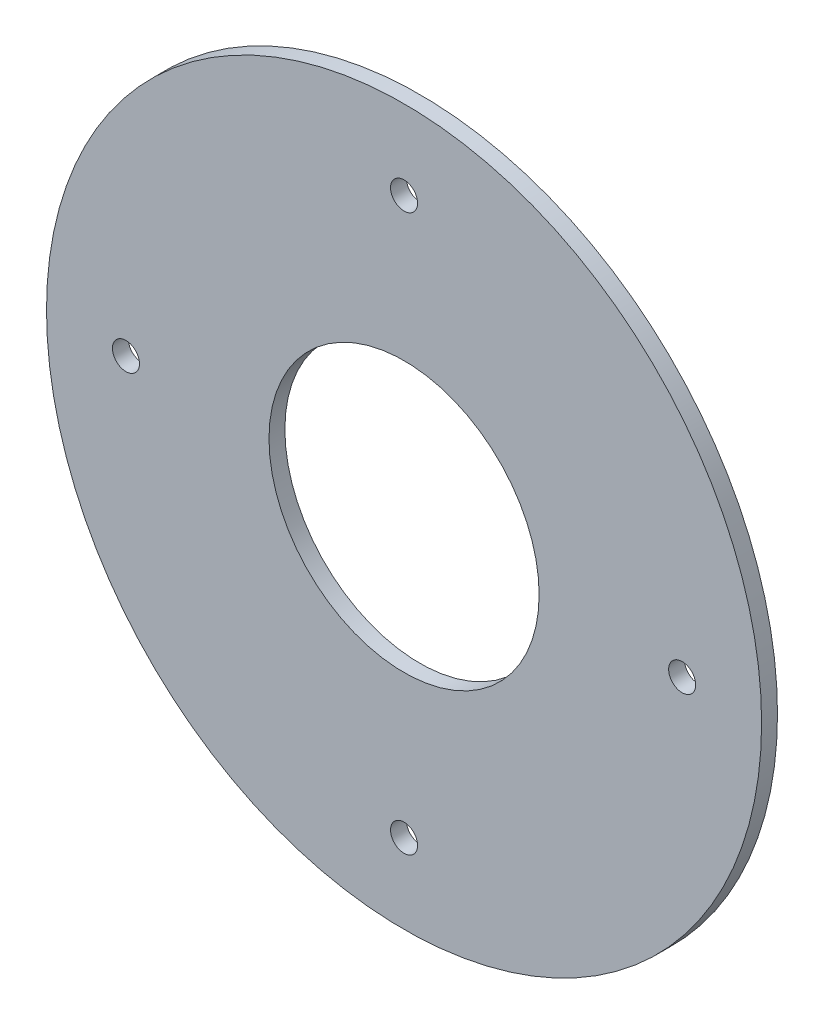
ISO-10303-21;
HEADER;
FILE_DESCRIPTION(('STEP AP214'),'2;1');
FILE_NAME('part.step','',(''),(''),'','','');
FILE_SCHEMA(('AUTOMOTIVE_DESIGN { 1 0 10303 214 1 1 1 1 }'));
ENDSEC;
DATA;
#1=APPLICATION_CONTEXT('core data for automotive mechanical design processes');
#2=APPLICATION_PROTOCOL_DEFINITION('international standard','automotive_design',2000,#1);
#3=PRODUCT_CONTEXT('',#1,'mechanical');
#4=PRODUCT('Part','Part','',(#3));
#5=PRODUCT_RELATED_PRODUCT_CATEGORY('part','',(#4));
#6=PRODUCT_DEFINITION_FORMATION('','',#4);
#7=PRODUCT_DEFINITION_CONTEXT('part definition',#1,'design');
#8=PRODUCT_DEFINITION('design','',#6,#7);
#9=PRODUCT_DEFINITION_SHAPE('','',#8);
#10=(LENGTH_UNIT() NAMED_UNIT(*) SI_UNIT(.MILLI.,.METRE.));
#11=(NAMED_UNIT(*) PLANE_ANGLE_UNIT() SI_UNIT($,.RADIAN.));
#12=(NAMED_UNIT(*) SI_UNIT($,.STERADIAN.) SOLID_ANGLE_UNIT());
#13=UNCERTAINTY_MEASURE_WITH_UNIT(LENGTH_MEASURE(1.E-05),#10,'distance_accuracy_value','');
#14=(GEOMETRIC_REPRESENTATION_CONTEXT(3) GLOBAL_UNCERTAINTY_ASSIGNED_CONTEXT((#13)) GLOBAL_UNIT_ASSIGNED_CONTEXT((#10,
#11,#12)) REPRESENTATION_CONTEXT('',''));
#15=CARTESIAN_POINT('',(0.,0.,0.));
#16=DIRECTION('',(0.,0.,1.));
#17=DIRECTION('',(1.,0.,0.));
#18=AXIS2_PLACEMENT_3D('',#15,#16,#17);
#19=CARTESIAN_POINT('',(0.,0.,2.));
#20=DIRECTION('',(0.,0.,1.));
#21=DIRECTION('',(1.,0.,0.));
#22=AXIS2_PLACEMENT_3D('',#19,#20,#21);
#23=PLANE('',#22);
#24=CARTESIAN_POINT('',(0.,35.,2.));
#25=DIRECTION('',(0.,0.,1.));
#26=DIRECTION('',(1.,0.,0.));
#27=AXIS2_PLACEMENT_3D('',#24,#25,#26);
#28=CIRCLE('',#27,1.7);
#29=CARTESIAN_POINT('',(1.7,35.,2.));
#30=VERTEX_POINT('',#29);
#31=EDGE_CURVE('E72',#30,#30,#28,.T.);
#32=ORIENTED_EDGE('',*,*,#31,.F.);
#33=EDGE_LOOP('',(#32));
#34=FACE_BOUND('',#33,.T.);
#35=CARTESIAN_POINT('',(-35.,0.,2.));
#36=DIRECTION('',(0.,0.,1.));
#37=DIRECTION('',(1.,0.,0.));
#38=AXIS2_PLACEMENT_3D('',#35,#36,#37);
#39=CIRCLE('',#38,1.7);
#40=CARTESIAN_POINT('',(-33.3,0.,2.));
#41=VERTEX_POINT('',#40);
#42=EDGE_CURVE('E66',#41,#41,#39,.T.);
#43=ORIENTED_EDGE('',*,*,#42,.F.);
#44=EDGE_LOOP('',(#43));
#45=FACE_BOUND('',#44,.T.);
#46=CARTESIAN_POINT('',(0.,-35.,2.));
#47=DIRECTION('',(0.,0.,1.));
#48=DIRECTION('',(1.,0.,0.));
#49=AXIS2_PLACEMENT_3D('',#46,#47,#48);
#50=CIRCLE('',#49,1.7);
#51=CARTESIAN_POINT('',(1.7,-35.,2.));
#52=VERTEX_POINT('',#51);
#53=EDGE_CURVE('E60',#52,#52,#50,.T.);
#54=ORIENTED_EDGE('',*,*,#53,.F.);
#55=EDGE_LOOP('',(#54));
#56=FACE_BOUND('',#55,.T.);
#57=CARTESIAN_POINT('',(35.,0.,2.));
#58=DIRECTION('',(0.,0.,1.));
#59=DIRECTION('',(1.,0.,0.));
#60=AXIS2_PLACEMENT_3D('',#57,#58,#59);
#61=CIRCLE('',#60,1.7);
#62=CARTESIAN_POINT('',(36.7,0.,2.));
#63=VERTEX_POINT('',#62);
#64=EDGE_CURVE('E54',#63,#63,#61,.T.);
#65=ORIENTED_EDGE('',*,*,#64,.F.);
#66=EDGE_LOOP('',(#65));
#67=FACE_BOUND('',#66,.T.);
#68=CARTESIAN_POINT('',(0.,0.,2.));
#69=DIRECTION('',(0.,0.,1.));
#70=DIRECTION('',(1.,0.,0.));
#71=AXIS2_PLACEMENT_3D('',#68,#69,#70);
#72=CIRCLE('',#71,45.);
#73=CARTESIAN_POINT('',(45.,0.,2.));
#74=VERTEX_POINT('',#73);
#75=EDGE_CURVE('E10',#74,#74,#72,.T.);
#76=ORIENTED_EDGE('',*,*,#75,.T.);
#77=EDGE_LOOP('',(#76));
#78=FACE_BOUND('',#77,.T.);
#79=CARTESIAN_POINT('',(0.,0.,2.));
#80=DIRECTION('',(0.,0.,1.));
#81=DIRECTION('',(1.,0.,0.));
#82=AXIS2_PLACEMENT_3D('',#79,#80,#81);
#83=CIRCLE('',#82,17.);
#84=CARTESIAN_POINT('',(17.,0.,2.));
#85=VERTEX_POINT('',#84);
#86=EDGE_CURVE('E44',#85,#85,#83,.T.);
#87=ORIENTED_EDGE('',*,*,#86,.F.);
#88=EDGE_LOOP('',(#87));
#89=FACE_BOUND('',#88,.T.);
#90=ADVANCED_FACE('F33',(#34,#45,#56,#67,#78,#89),#23,.T.);
#91=CARTESIAN_POINT('',(0.,0.,0.));
#92=DIRECTION('',(0.,0.,1.));
#93=DIRECTION('',(1.,0.,0.));
#94=AXIS2_PLACEMENT_3D('',#91,#92,#93);
#95=PLANE('',#94);
#96=CARTESIAN_POINT('',(0.,35.,0.));
#97=DIRECTION('',(0.,0.,1.));
#98=DIRECTION('',(1.,0.,0.));
#99=AXIS2_PLACEMENT_3D('',#96,#97,#98);
#100=CIRCLE('',#99,1.7);
#101=CARTESIAN_POINT('',(1.7,35.,0.));
#102=VERTEX_POINT('',#101);
#103=EDGE_CURVE('E69',#102,#102,#100,.T.);
#104=ORIENTED_EDGE('',*,*,#103,.T.);
#105=EDGE_LOOP('',(#104));
#106=FACE_BOUND('',#105,.T.);
#107=CARTESIAN_POINT('',(-35.,0.,0.));
#108=DIRECTION('',(0.,0.,1.));
#109=DIRECTION('',(1.,0.,0.));
#110=AXIS2_PLACEMENT_3D('',#107,#108,#109);
#111=CIRCLE('',#110,1.7);
#112=CARTESIAN_POINT('',(-33.3,0.,0.));
#113=VERTEX_POINT('',#112);
#114=EDGE_CURVE('E63',#113,#113,#111,.T.);
#115=ORIENTED_EDGE('',*,*,#114,.T.);
#116=EDGE_LOOP('',(#115));
#117=FACE_BOUND('',#116,.T.);
#118=CARTESIAN_POINT('',(0.,-35.,0.));
#119=DIRECTION('',(0.,0.,1.));
#120=DIRECTION('',(1.,0.,0.));
#121=AXIS2_PLACEMENT_3D('',#118,#119,#120);
#122=CIRCLE('',#121,1.7);
#123=CARTESIAN_POINT('',(1.7,-35.,0.));
#124=VERTEX_POINT('',#123);
#125=EDGE_CURVE('E57',#124,#124,#122,.T.);
#126=ORIENTED_EDGE('',*,*,#125,.T.);
#127=EDGE_LOOP('',(#126));
#128=FACE_BOUND('',#127,.T.);
#129=CARTESIAN_POINT('',(35.,0.,0.));
#130=DIRECTION('',(0.,0.,1.));
#131=DIRECTION('',(1.,0.,0.));
#132=AXIS2_PLACEMENT_3D('',#129,#130,#131);
#133=CIRCLE('',#132,1.7);
#134=CARTESIAN_POINT('',(36.7,0.,0.));
#135=VERTEX_POINT('',#134);
#136=EDGE_CURVE('E49',#135,#135,#133,.T.);
#137=ORIENTED_EDGE('',*,*,#136,.T.);
#138=EDGE_LOOP('',(#137));
#139=FACE_BOUND('',#138,.T.);
#140=CARTESIAN_POINT('',(0.,0.,0.));
#141=DIRECTION('',(0.,0.,1.));
#142=DIRECTION('',(1.,0.,0.));
#143=AXIS2_PLACEMENT_3D('',#140,#141,#142);
#144=CIRCLE('',#143,45.);
#145=CARTESIAN_POINT('',(45.,0.,0.));
#146=VERTEX_POINT('',#145);
#147=EDGE_CURVE('E37',#146,#146,#144,.T.);
#148=ORIENTED_EDGE('',*,*,#147,.F.);
#149=EDGE_LOOP('',(#148));
#150=FACE_BOUND('',#149,.T.);
#151=CARTESIAN_POINT('',(0.,0.,0.));
#152=DIRECTION('',(0.,0.,1.));
#153=DIRECTION('',(1.,0.,0.));
#154=AXIS2_PLACEMENT_3D('',#151,#152,#153);
#155=CIRCLE('',#154,17.);
#156=CARTESIAN_POINT('',(17.,0.,0.));
#157=VERTEX_POINT('',#156);
#158=EDGE_CURVE('E46',#157,#157,#155,.T.);
#159=ORIENTED_EDGE('',*,*,#158,.T.);
#160=EDGE_LOOP('',(#159));
#161=FACE_BOUND('',#160,.T.);
#162=ADVANCED_FACE('F80',(#106,#117,#128,#139,#150,#161),#95,.F.);
#163=CARTESIAN_POINT('',(0.,0.,2.));
#164=DIRECTION('',(0.,0.,-1.));
#165=DIRECTION('',(-1.,0.,0.));
#166=AXIS2_PLACEMENT_3D('',#163,#164,#165);
#167=CYLINDRICAL_SURFACE('',#166,45.);
#168=ORIENTED_EDGE('',*,*,#75,.F.);
#169=EDGE_LOOP('',(#168));
#170=FACE_BOUND('',#169,.T.);
#171=ORIENTED_EDGE('',*,*,#147,.T.);
#172=EDGE_LOOP('',(#171));
#173=FACE_BOUND('',#172,.T.);
#174=ADVANCED_FACE('F35',(#170,#173),#167,.T.);
#175=CARTESIAN_POINT('',(0.,0.,2.));
#176=DIRECTION('',(0.,0.,-1.));
#177=DIRECTION('',(-1.,0.,0.));
#178=AXIS2_PLACEMENT_3D('',#175,#176,#177);
#179=CYLINDRICAL_SURFACE('',#178,17.);
#180=ORIENTED_EDGE('',*,*,#86,.T.);
#181=EDGE_LOOP('',(#180));
#182=FACE_BOUND('',#181,.T.);
#183=ORIENTED_EDGE('',*,*,#158,.F.);
#184=EDGE_LOOP('',(#183));
#185=FACE_BOUND('',#184,.T.);
#186=ADVANCED_FACE('F90',(#182,#185),#179,.F.);
#187=CARTESIAN_POINT('',(35.,0.,2.));
#188=DIRECTION('',(0.,0.,1.));
#189=DIRECTION('',(1.,0.,0.));
#190=AXIS2_PLACEMENT_3D('',#187,#188,#189);
#191=CYLINDRICAL_SURFACE('',#190,1.7);
#192=ORIENTED_EDGE('',*,*,#136,.F.);
#193=EDGE_LOOP('',(#192));
#194=FACE_BOUND('',#193,.T.);
#195=ORIENTED_EDGE('',*,*,#64,.T.);
#196=EDGE_LOOP('',(#195));
#197=FACE_BOUND('',#196,.T.);
#198=ADVANCED_FACE('F93',(#194,#197),#191,.F.);
#199=CARTESIAN_POINT('',(0.,-35.,2.));
#200=DIRECTION('',(0.,0.,1.));
#201=DIRECTION('',(1.,0.,0.));
#202=AXIS2_PLACEMENT_3D('',#199,#200,#201);
#203=CYLINDRICAL_SURFACE('',#202,1.7);
#204=ORIENTED_EDGE('',*,*,#125,.F.);
#205=EDGE_LOOP('',(#204));
#206=FACE_BOUND('',#205,.T.);
#207=ORIENTED_EDGE('',*,*,#53,.T.);
#208=EDGE_LOOP('',(#207));
#209=FACE_BOUND('',#208,.T.);
#210=ADVANCED_FACE('F107',(#206,#209),#203,.F.);
#211=CARTESIAN_POINT('',(-35.,0.,2.));
#212=DIRECTION('',(0.,0.,1.));
#213=DIRECTION('',(1.,0.,0.));
#214=AXIS2_PLACEMENT_3D('',#211,#212,#213);
#215=CYLINDRICAL_SURFACE('',#214,1.7);
#216=ORIENTED_EDGE('',*,*,#114,.F.);
#217=EDGE_LOOP('',(#216));
#218=FACE_BOUND('',#217,.T.);
#219=ORIENTED_EDGE('',*,*,#42,.T.);
#220=EDGE_LOOP('',(#219));
#221=FACE_BOUND('',#220,.T.);
#222=ADVANCED_FACE('F111',(#218,#221),#215,.F.);
#223=CARTESIAN_POINT('',(0.,35.,2.));
#224=DIRECTION('',(0.,0.,1.));
#225=DIRECTION('',(1.,0.,0.));
#226=AXIS2_PLACEMENT_3D('',#223,#224,#225);
#227=CYLINDRICAL_SURFACE('',#226,1.7);
#228=ORIENTED_EDGE('',*,*,#103,.F.);
#229=EDGE_LOOP('',(#228));
#230=FACE_BOUND('',#229,.T.);
#231=ORIENTED_EDGE('',*,*,#31,.T.);
#232=EDGE_LOOP('',(#231));
#233=FACE_BOUND('',#232,.T.);
#234=ADVANCED_FACE('F76',(#230,#233),#227,.F.);
#235=CLOSED_SHELL('',(#90,#162,#174,#186,#198,#210,#222,#234));
#236=MANIFOLD_SOLID_BREP('B2',#235);
#237=ADVANCED_BREP_SHAPE_REPRESENTATION('',(#18,#236),#14);
#238=SHAPE_DEFINITION_REPRESENTATION(#9,#237);
ENDSEC;
END-ISO-10303-21;
